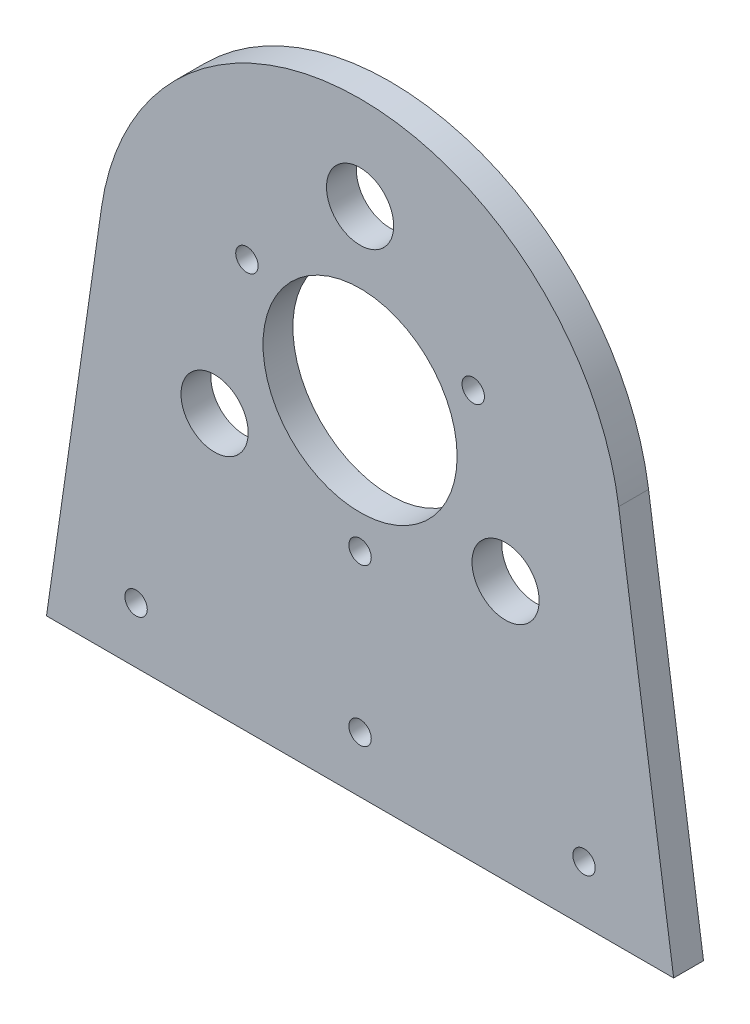
ISO-10303-21;
HEADER;
FILE_DESCRIPTION(('STEP AP214'),'2;1');
FILE_NAME('part.step','',(''),(''),'','','');
FILE_SCHEMA(('AUTOMOTIVE_DESIGN { 1 0 10303 214 1 1 1 1 }'));
ENDSEC;
DATA;
#1=APPLICATION_CONTEXT('core data for automotive mechanical design processes');
#2=APPLICATION_PROTOCOL_DEFINITION('international standard','automotive_design',2000,#1);
#3=PRODUCT_CONTEXT('',#1,'mechanical');
#4=PRODUCT('Part','Part','',(#3));
#5=PRODUCT_RELATED_PRODUCT_CATEGORY('part','',(#4));
#6=PRODUCT_DEFINITION_FORMATION('','',#4);
#7=PRODUCT_DEFINITION_CONTEXT('part definition',#1,'design');
#8=PRODUCT_DEFINITION('design','',#6,#7);
#9=PRODUCT_DEFINITION_SHAPE('','',#8);
#10=(LENGTH_UNIT() NAMED_UNIT(*) SI_UNIT(.MILLI.,.METRE.));
#11=(NAMED_UNIT(*) PLANE_ANGLE_UNIT() SI_UNIT($,.RADIAN.));
#12=(NAMED_UNIT(*) SI_UNIT($,.STERADIAN.) SOLID_ANGLE_UNIT());
#13=UNCERTAINTY_MEASURE_WITH_UNIT(LENGTH_MEASURE(1.E-05),#10,'distance_accuracy_value','');
#14=(GEOMETRIC_REPRESENTATION_CONTEXT(3) GLOBAL_UNCERTAINTY_ASSIGNED_CONTEXT((#13)) GLOBAL_UNIT_ASSIGNED_CONTEXT((#10,
#11,#12)) REPRESENTATION_CONTEXT('',''));
#15=CARTESIAN_POINT('',(0.,0.,0.));
#16=DIRECTION('',(0.,0.,1.));
#17=DIRECTION('',(1.,0.,0.));
#18=AXIS2_PLACEMENT_3D('',#15,#16,#17);
#19=CARTESIAN_POINT('',(34.6412304897537,4.99851479499249,4.));
#20=DIRECTION('',(0.989749442564391,0.142814708428357,0.));
#21=DIRECTION('',(-0.142814708428357,0.989749442564391,0.));
#22=AXIS2_PLACEMENT_3D('',#19,#20,#21);
#23=PLANE('',#22);
#24=DIRECTION('',(0.142814708428357,-0.989749442564391,0.));
#25=VECTOR('',#24,1.);
#26=CARTESIAN_POINT('',(34.6412304897537,4.99851479499249,0.));
#27=LINE('',#26,#25);
#28=CARTESIAN_POINT('',(34.6412304897537,4.9985147949925,0.));
#29=VERTEX_POINT('',#28);
#30=CARTESIAN_POINT('',(42.,-46.,0.));
#31=VERTEX_POINT('',#30);
#32=EDGE_CURVE('E114',#29,#31,#27,.T.);
#33=ORIENTED_EDGE('',*,*,#32,.F.);
#34=DIRECTION('',(0.,0.,-1.));
#35=VECTOR('',#34,1.);
#36=CARTESIAN_POINT('',(34.6412304897537,4.9985147949925,4.));
#37=LINE('',#36,#35);
#38=CARTESIAN_POINT('',(34.6412304897537,4.9985147949925,4.));
#39=VERTEX_POINT('',#38);
#40=EDGE_CURVE('E11',#39,#29,#37,.T.);
#41=ORIENTED_EDGE('',*,*,#40,.F.);
#42=DIRECTION('',(0.142814708428357,-0.989749442564391,0.));
#43=VECTOR('',#42,1.);
#44=CARTESIAN_POINT('',(34.6412304897537,4.99851479499249,4.));
#45=LINE('',#44,#43);
#46=CARTESIAN_POINT('',(42.,-46.,4.));
#47=VERTEX_POINT('',#46);
#48=EDGE_CURVE('E91',#39,#47,#45,.T.);
#49=ORIENTED_EDGE('',*,*,#48,.T.);
#50=DIRECTION('',(0.,0.,-1.));
#51=VECTOR('',#50,1.);
#52=CARTESIAN_POINT('',(42.,-46.,4.));
#53=LINE('',#52,#51);
#54=EDGE_CURVE('E58',#47,#31,#53,.T.);
#55=ORIENTED_EDGE('',*,*,#54,.T.);
#56=EDGE_LOOP('',(#33,#41,#49,#55));
#57=FACE_BOUND('',#56,.T.);
#58=ADVANCED_FACE('F41',(#57),#23,.T.);
#59=CARTESIAN_POINT('',(0.,0.,4.));
#60=DIRECTION('',(0.,0.,-1.));
#61=DIRECTION('',(-1.,0.,0.));
#62=AXIS2_PLACEMENT_3D('',#59,#60,#61);
#63=CYLINDRICAL_SURFACE('',#62,35.);
#64=CARTESIAN_POINT('',(0.,0.,0.));
#65=DIRECTION('',(0.,0.,1.));
#66=DIRECTION('',(1.,0.,0.));
#67=AXIS2_PLACEMENT_3D('',#64,#65,#66);
#68=CIRCLE('',#67,35.);
#69=CARTESIAN_POINT('',(-34.6412304897537,4.9985147949925,0.));
#70=VERTEX_POINT('',#69);
#71=EDGE_CURVE('E98',#29,#70,#68,.T.);
#72=ORIENTED_EDGE('',*,*,#71,.T.);
#73=DIRECTION('',(0.,0.,-1.));
#74=VECTOR('',#73,1.);
#75=CARTESIAN_POINT('',(-34.6412304897537,4.9985147949925,4.));
#76=LINE('',#75,#74);
#77=CARTESIAN_POINT('',(-34.6412304897537,4.9985147949925,4.));
#78=VERTEX_POINT('',#77);
#79=EDGE_CURVE('E50',#78,#70,#76,.T.);
#80=ORIENTED_EDGE('',*,*,#79,.F.);
#81=CARTESIAN_POINT('',(0.,0.,4.));
#82=DIRECTION('',(0.,0.,1.));
#83=DIRECTION('',(1.,0.,0.));
#84=AXIS2_PLACEMENT_3D('',#81,#82,#83);
#85=CIRCLE('',#84,35.);
#86=EDGE_CURVE('E84',#39,#78,#85,.T.);
#87=ORIENTED_EDGE('',*,*,#86,.F.);
#88=ORIENTED_EDGE('',*,*,#40,.T.);
#89=EDGE_LOOP('',(#72,#80,#87,#88));
#90=FACE_BOUND('',#89,.T.);
#91=ADVANCED_FACE('F96',(#90),#63,.T.);
#92=CARTESIAN_POINT('',(-34.6412304897537,4.9985147949925,4.));
#93=DIRECTION('',(-0.989749442564391,0.142814708428357,0.));
#94=DIRECTION('',(-0.142814708428357,-0.989749442564391,0.));
#95=AXIS2_PLACEMENT_3D('',#92,#93,#94);
#96=PLANE('',#95);
#97=DIRECTION('',(0.142814708428357,0.989749442564391,0.));
#98=VECTOR('',#97,1.);
#99=CARTESIAN_POINT('',(-34.6412304897537,4.9985147949925,0.));
#100=LINE('',#99,#98);
#101=CARTESIAN_POINT('',(-42.,-46.,0.));
#102=VERTEX_POINT('',#101);
#103=EDGE_CURVE('E120',#102,#70,#100,.T.);
#104=ORIENTED_EDGE('',*,*,#103,.F.);
#105=DIRECTION('',(0.,0.,-1.));
#106=VECTOR('',#105,1.);
#107=CARTESIAN_POINT('',(-42.,-46.,4.));
#108=LINE('',#107,#106);
#109=CARTESIAN_POINT('',(-42.,-46.,4.));
#110=VERTEX_POINT('',#109);
#111=EDGE_CURVE('E71',#110,#102,#108,.T.);
#112=ORIENTED_EDGE('',*,*,#111,.F.);
#113=DIRECTION('',(0.142814708428357,0.989749442564391,0.));
#114=VECTOR('',#113,1.);
#115=CARTESIAN_POINT('',(-34.6412304897537,4.9985147949925,4.));
#116=LINE('',#115,#114);
#117=EDGE_CURVE('E90',#110,#78,#116,.T.);
#118=ORIENTED_EDGE('',*,*,#117,.T.);
#119=ORIENTED_EDGE('',*,*,#79,.T.);
#120=EDGE_LOOP('',(#104,#112,#118,#119));
#121=FACE_BOUND('',#120,.T.);
#122=ADVANCED_FACE('F102',(#121),#96,.T.);
#123=CARTESIAN_POINT('',(0.,-46.,4.));
#124=DIRECTION('',(0.,-1.,0.));
#125=DIRECTION('',(1.,0.,0.));
#126=AXIS2_PLACEMENT_3D('',#123,#124,#125);
#127=PLANE('',#126);
#128=DIRECTION('',(-1.,0.,0.));
#129=VECTOR('',#128,1.);
#130=CARTESIAN_POINT('',(0.,-46.,0.));
#131=LINE('',#130,#129);
#132=EDGE_CURVE('E123',#31,#102,#131,.T.);
#133=ORIENTED_EDGE('',*,*,#132,.F.);
#134=ORIENTED_EDGE('',*,*,#54,.F.);
#135=DIRECTION('',(-1.,0.,0.));
#136=VECTOR('',#135,1.);
#137=CARTESIAN_POINT('',(0.,-46.,4.));
#138=LINE('',#137,#136);
#139=EDGE_CURVE('E104',#47,#110,#138,.T.);
#140=ORIENTED_EDGE('',*,*,#139,.T.);
#141=ORIENTED_EDGE('',*,*,#111,.T.);
#142=EDGE_LOOP('',(#133,#134,#140,#141));
#143=FACE_BOUND('',#142,.T.);
#144=ADVANCED_FACE('F260',(#143),#127,.T.);
#145=CARTESIAN_POINT('',(0.,0.,4.));
#146=DIRECTION('',(0.,0.,-1.));
#147=DIRECTION('',(-1.,0.,0.));
#148=AXIS2_PLACEMENT_3D('',#145,#146,#147);
#149=CYLINDRICAL_SURFACE('',#148,13.);
#150=CARTESIAN_POINT('',(0.,0.,4.));
#151=DIRECTION('',(0.,0.,1.));
#152=DIRECTION('',(1.,0.,0.));
#153=AXIS2_PLACEMENT_3D('',#150,#151,#152);
#154=CIRCLE('',#153,13.);
#155=CARTESIAN_POINT('',(13.,0.,4.));
#156=VERTEX_POINT('',#155);
#157=EDGE_CURVE('E107',#156,#156,#154,.T.);
#158=ORIENTED_EDGE('',*,*,#157,.T.);
#159=EDGE_LOOP('',(#158));
#160=FACE_BOUND('',#159,.T.);
#161=CARTESIAN_POINT('',(0.,0.,0.));
#162=DIRECTION('',(0.,0.,1.));
#163=DIRECTION('',(1.,0.,0.));
#164=AXIS2_PLACEMENT_3D('',#161,#162,#163);
#165=CIRCLE('',#164,13.);
#166=CARTESIAN_POINT('',(13.,0.,0.));
#167=VERTEX_POINT('',#166);
#168=EDGE_CURVE('E127',#167,#167,#165,.T.);
#169=ORIENTED_EDGE('',*,*,#168,.F.);
#170=EDGE_LOOP('',(#169));
#171=FACE_BOUND('',#170,.T.);
#172=ADVANCED_FACE('F223',(#160,#171),#149,.F.);
#173=CARTESIAN_POINT('',(0.,0.,4.));
#174=DIRECTION('',(0.,0.,1.));
#175=DIRECTION('',(1.,0.,0.));
#176=AXIS2_PLACEMENT_3D('',#173,#174,#175);
#177=PLANE('',#176);
#178=CARTESIAN_POINT('',(30.,-38.5,4.));
#179=DIRECTION('',(0.,0.,1.));
#180=DIRECTION('',(-1.,0.,0.));
#181=AXIS2_PLACEMENT_3D('',#178,#179,#180);
#182=CIRCLE('',#181,1.5);
#183=CARTESIAN_POINT('',(28.5,-38.5,4.));
#184=VERTEX_POINT('',#183);
#185=EDGE_CURVE('E194',#184,#184,#182,.T.);
#186=ORIENTED_EDGE('',*,*,#185,.F.);
#187=EDGE_LOOP('',(#186));
#188=FACE_BOUND('',#187,.T.);
#189=CARTESIAN_POINT('',(-30.,-38.5,4.));
#190=DIRECTION('',(0.,0.,1.));
#191=DIRECTION('',(1.,0.,0.));
#192=AXIS2_PLACEMENT_3D('',#189,#190,#191);
#193=CIRCLE('',#192,1.5);
#194=CARTESIAN_POINT('',(-28.5,-38.5,4.));
#195=VERTEX_POINT('',#194);
#196=EDGE_CURVE('E202',#195,#195,#193,.T.);
#197=ORIENTED_EDGE('',*,*,#196,.F.);
#198=EDGE_LOOP('',(#197));
#199=FACE_BOUND('',#198,.T.);
#200=CARTESIAN_POINT('',(0.,-38.5,4.));
#201=DIRECTION('',(0.,0.,1.));
#202=DIRECTION('',(1.,0.,0.));
#203=AXIS2_PLACEMENT_3D('',#200,#201,#202);
#204=CIRCLE('',#203,1.5);
#205=CARTESIAN_POINT('',(1.5,-38.5,4.));
#206=VERTEX_POINT('',#205);
#207=EDGE_CURVE('E186',#206,#206,#204,.T.);
#208=ORIENTED_EDGE('',*,*,#207,.F.);
#209=EDGE_LOOP('',(#208));
#210=FACE_BOUND('',#209,.T.);
#211=CARTESIAN_POINT('',(15.1554445662276,8.75000000000008,4.));
#212=DIRECTION('',(0.,0.,1.));
#213=DIRECTION('',(1.,0.,0.));
#214=AXIS2_PLACEMENT_3D('',#211,#212,#213);
#215=CIRCLE('',#214,1.5);
#216=CARTESIAN_POINT('',(16.6554445662276,8.75000000000008,4.));
#217=VERTEX_POINT('',#216);
#218=EDGE_CURVE('E143',#217,#217,#215,.T.);
#219=ORIENTED_EDGE('',*,*,#218,.F.);
#220=EDGE_LOOP('',(#219));
#221=FACE_BOUND('',#220,.T.);
#222=CARTESIAN_POINT('',(0.,-17.5,4.));
#223=DIRECTION('',(0.,0.,1.));
#224=DIRECTION('',(1.,0.,0.));
#225=AXIS2_PLACEMENT_3D('',#222,#223,#224);
#226=CIRCLE('',#225,1.5);
#227=CARTESIAN_POINT('',(1.5,-17.5,4.));
#228=VERTEX_POINT('',#227);
#229=EDGE_CURVE('E172',#228,#228,#226,.T.);
#230=ORIENTED_EDGE('',*,*,#229,.F.);
#231=EDGE_LOOP('',(#230));
#232=FACE_BOUND('',#231,.T.);
#233=CARTESIAN_POINT('',(-15.1554445662276,8.75000000000007,4.));
#234=DIRECTION('',(0.,0.,1.));
#235=DIRECTION('',(1.,0.,0.));
#236=AXIS2_PLACEMENT_3D('',#233,#234,#235);
#237=CIRCLE('',#236,1.5);
#238=CARTESIAN_POINT('',(-13.6554445662276,8.75000000000007,4.));
#239=VERTEX_POINT('',#238);
#240=EDGE_CURVE('E162',#239,#239,#237,.T.);
#241=ORIENTED_EDGE('',*,*,#240,.F.);
#242=EDGE_LOOP('',(#241));
#243=FACE_BOUND('',#242,.T.);
#244=CARTESIAN_POINT('',(0.,22.5,4.));
#245=DIRECTION('',(0.,0.,1.));
#246=DIRECTION('',(1.,0.,0.));
#247=AXIS2_PLACEMENT_3D('',#244,#245,#246);
#248=CIRCLE('',#247,4.5);
#249=CARTESIAN_POINT('',(4.5,22.5,4.));
#250=VERTEX_POINT('',#249);
#251=EDGE_CURVE('E155',#250,#250,#248,.T.);
#252=ORIENTED_EDGE('',*,*,#251,.F.);
#253=EDGE_LOOP('',(#252));
#254=FACE_BOUND('',#253,.T.);
#255=CARTESIAN_POINT('',(19.4855715851513,-11.2499999999992,4.));
#256=DIRECTION('',(0.,0.,1.));
#257=DIRECTION('',(1.,0.,0.));
#258=AXIS2_PLACEMENT_3D('',#255,#256,#257);
#259=CIRCLE('',#258,4.50000000000123);
#260=CARTESIAN_POINT('',(23.9855715851525,-11.2499999999992,4.));
#261=VERTEX_POINT('',#260);
#262=EDGE_CURVE('E147',#261,#261,#259,.T.);
#263=ORIENTED_EDGE('',*,*,#262,.F.);
#264=EDGE_LOOP('',(#263));
#265=FACE_BOUND('',#264,.T.);
#266=CARTESIAN_POINT('',(-19.4855715851484,-11.2500000000008,4.));
#267=DIRECTION('',(0.,0.,1.));
#268=DIRECTION('',(1.,0.,0.));
#269=AXIS2_PLACEMENT_3D('',#266,#267,#268);
#270=CIRCLE('',#269,4.50000000000182);
#271=CARTESIAN_POINT('',(-14.9855715851466,-11.2500000000008,4.));
#272=VERTEX_POINT('',#271);
#273=EDGE_CURVE('E138',#272,#272,#270,.T.);
#274=ORIENTED_EDGE('',*,*,#273,.F.);
#275=EDGE_LOOP('',(#274));
#276=FACE_BOUND('',#275,.T.);
#277=ORIENTED_EDGE('',*,*,#48,.F.);
#278=ORIENTED_EDGE('',*,*,#86,.T.);
#279=ORIENTED_EDGE('',*,*,#117,.F.);
#280=ORIENTED_EDGE('',*,*,#139,.F.);
#281=EDGE_LOOP('',(#277,#278,#279,#280));
#282=FACE_BOUND('',#281,.T.);
#283=ORIENTED_EDGE('',*,*,#157,.F.);
#284=EDGE_LOOP('',(#283));
#285=FACE_BOUND('',#284,.T.);
#286=ADVANCED_FACE('F86',(#188,#199,#210,#221,#232,#243,#254,#265,#276,#282,#285),#177,.T.);
#287=CARTESIAN_POINT('',(0.,0.,0.));
#288=DIRECTION('',(0.,0.,1.));
#289=DIRECTION('',(1.,0.,0.));
#290=AXIS2_PLACEMENT_3D('',#287,#288,#289);
#291=PLANE('',#290);
#292=CARTESIAN_POINT('',(30.,-38.5,0.));
#293=DIRECTION('',(0.,0.,1.));
#294=DIRECTION('',(-1.,0.,0.));
#295=AXIS2_PLACEMENT_3D('',#292,#293,#294);
#296=CIRCLE('',#295,1.5);
#297=CARTESIAN_POINT('',(28.5,-38.5,0.));
#298=VERTEX_POINT('',#297);
#299=EDGE_CURVE('E198',#298,#298,#296,.T.);
#300=ORIENTED_EDGE('',*,*,#299,.T.);
#301=EDGE_LOOP('',(#300));
#302=FACE_BOUND('',#301,.T.);
#303=CARTESIAN_POINT('',(-30.,-38.5,0.));
#304=DIRECTION('',(0.,0.,1.));
#305=DIRECTION('',(1.,0.,0.));
#306=AXIS2_PLACEMENT_3D('',#303,#304,#305);
#307=CIRCLE('',#306,1.5);
#308=CARTESIAN_POINT('',(-28.5,-38.5,0.));
#309=VERTEX_POINT('',#308);
#310=EDGE_CURVE('E190',#309,#309,#307,.T.);
#311=ORIENTED_EDGE('',*,*,#310,.T.);
#312=EDGE_LOOP('',(#311));
#313=FACE_BOUND('',#312,.T.);
#314=CARTESIAN_POINT('',(0.,-38.5,0.));
#315=DIRECTION('',(0.,0.,1.));
#316=DIRECTION('',(1.,0.,0.));
#317=AXIS2_PLACEMENT_3D('',#314,#315,#316);
#318=CIRCLE('',#317,1.5);
#319=CARTESIAN_POINT('',(1.5,-38.5,0.));
#320=VERTEX_POINT('',#319);
#321=EDGE_CURVE('E171',#320,#320,#318,.T.);
#322=ORIENTED_EDGE('',*,*,#321,.T.);
#323=EDGE_LOOP('',(#322));
#324=FACE_BOUND('',#323,.T.);
#325=CARTESIAN_POINT('',(15.1554445662276,8.75000000000008,0.));
#326=DIRECTION('',(0.,0.,1.));
#327=DIRECTION('',(1.,0.,0.));
#328=AXIS2_PLACEMENT_3D('',#325,#326,#327);
#329=CIRCLE('',#328,1.5);
#330=CARTESIAN_POINT('',(16.6554445662276,8.75000000000008,0.));
#331=VERTEX_POINT('',#330);
#332=EDGE_CURVE('E176',#331,#331,#329,.T.);
#333=ORIENTED_EDGE('',*,*,#332,.T.);
#334=EDGE_LOOP('',(#333));
#335=FACE_BOUND('',#334,.T.);
#336=CARTESIAN_POINT('',(0.,-17.5,0.));
#337=DIRECTION('',(0.,0.,1.));
#338=DIRECTION('',(1.,0.,0.));
#339=AXIS2_PLACEMENT_3D('',#336,#337,#338);
#340=CIRCLE('',#339,1.5);
#341=CARTESIAN_POINT('',(1.5,-17.5,0.));
#342=VERTEX_POINT('',#341);
#343=EDGE_CURVE('E166',#342,#342,#340,.T.);
#344=ORIENTED_EDGE('',*,*,#343,.T.);
#345=EDGE_LOOP('',(#344));
#346=FACE_BOUND('',#345,.T.);
#347=CARTESIAN_POINT('',(-15.1554445662276,8.75000000000007,0.));
#348=DIRECTION('',(0.,0.,1.));
#349=DIRECTION('',(1.,0.,0.));
#350=AXIS2_PLACEMENT_3D('',#347,#348,#349);
#351=CIRCLE('',#350,1.5);
#352=CARTESIAN_POINT('',(-13.6554445662276,8.75000000000007,0.));
#353=VERTEX_POINT('',#352);
#354=EDGE_CURVE('E167',#353,#353,#351,.T.);
#355=ORIENTED_EDGE('',*,*,#354,.T.);
#356=EDGE_LOOP('',(#355));
#357=FACE_BOUND('',#356,.T.);
#358=CARTESIAN_POINT('',(0.,22.5,0.));
#359=DIRECTION('',(0.,0.,1.));
#360=DIRECTION('',(1.,0.,0.));
#361=AXIS2_PLACEMENT_3D('',#358,#359,#360);
#362=CIRCLE('',#361,4.5);
#363=CARTESIAN_POINT('',(4.5,22.5,0.));
#364=VERTEX_POINT('',#363);
#365=EDGE_CURVE('E117',#364,#364,#362,.T.);
#366=ORIENTED_EDGE('',*,*,#365,.T.);
#367=EDGE_LOOP('',(#366));
#368=FACE_BOUND('',#367,.T.);
#369=CARTESIAN_POINT('',(19.4855715851513,-11.2499999999992,0.));
#370=DIRECTION('',(0.,0.,1.));
#371=DIRECTION('',(1.,0.,0.));
#372=AXIS2_PLACEMENT_3D('',#369,#370,#371);
#373=CIRCLE('',#372,4.50000000000123);
#374=CARTESIAN_POINT('',(23.9855715851525,-11.2499999999992,0.));
#375=VERTEX_POINT('',#374);
#376=EDGE_CURVE('E151',#375,#375,#373,.T.);
#377=ORIENTED_EDGE('',*,*,#376,.T.);
#378=EDGE_LOOP('',(#377));
#379=FACE_BOUND('',#378,.T.);
#380=CARTESIAN_POINT('',(-19.4855715851484,-11.2500000000008,0.));
#381=DIRECTION('',(0.,0.,1.));
#382=DIRECTION('',(1.,0.,0.));
#383=AXIS2_PLACEMENT_3D('',#380,#381,#382);
#384=CIRCLE('',#383,4.50000000000182);
#385=CARTESIAN_POINT('',(-14.9855715851466,-11.2500000000008,0.));
#386=VERTEX_POINT('',#385);
#387=EDGE_CURVE('E142',#386,#386,#384,.T.);
#388=ORIENTED_EDGE('',*,*,#387,.T.);
#389=EDGE_LOOP('',(#388));
#390=FACE_BOUND('',#389,.T.);
#391=ORIENTED_EDGE('',*,*,#32,.T.);
#392=ORIENTED_EDGE('',*,*,#132,.T.);
#393=ORIENTED_EDGE('',*,*,#103,.T.);
#394=ORIENTED_EDGE('',*,*,#71,.F.);
#395=EDGE_LOOP('',(#391,#392,#393,#394));
#396=FACE_BOUND('',#395,.T.);
#397=ORIENTED_EDGE('',*,*,#168,.T.);
#398=EDGE_LOOP('',(#397));
#399=FACE_BOUND('',#398,.T.);
#400=ADVANCED_FACE('F210',(#302,#313,#324,#335,#346,#357,#368,#379,#390,#396,#399),#291,.F.);
#401=CARTESIAN_POINT('',(-19.4855715851484,-11.2500000000008,0.));
#402=DIRECTION('',(0.,0.,1.));
#403=DIRECTION('',(1.,0.,0.));
#404=AXIS2_PLACEMENT_3D('',#401,#402,#403);
#405=CYLINDRICAL_SURFACE('',#404,4.50000000000182);
#406=ORIENTED_EDGE('',*,*,#387,.F.);
#407=EDGE_LOOP('',(#406));
#408=FACE_BOUND('',#407,.T.);
#409=ORIENTED_EDGE('',*,*,#273,.T.);
#410=EDGE_LOOP('',(#409));
#411=FACE_BOUND('',#410,.T.);
#412=ADVANCED_FACE('F240',(#408,#411),#405,.F.);
#413=CARTESIAN_POINT('',(19.4855715851513,-11.2499999999992,0.));
#414=DIRECTION('',(0.,0.,1.));
#415=DIRECTION('',(1.,0.,0.));
#416=AXIS2_PLACEMENT_3D('',#413,#414,#415);
#417=CYLINDRICAL_SURFACE('',#416,4.50000000000123);
#418=ORIENTED_EDGE('',*,*,#376,.F.);
#419=EDGE_LOOP('',(#418));
#420=FACE_BOUND('',#419,.T.);
#421=ORIENTED_EDGE('',*,*,#262,.T.);
#422=EDGE_LOOP('',(#421));
#423=FACE_BOUND('',#422,.T.);
#424=ADVANCED_FACE('F242',(#420,#423),#417,.F.);
#425=CARTESIAN_POINT('',(0.,22.5,0.));
#426=DIRECTION('',(0.,0.,1.));
#427=DIRECTION('',(1.,0.,0.));
#428=AXIS2_PLACEMENT_3D('',#425,#426,#427);
#429=CYLINDRICAL_SURFACE('',#428,4.5);
#430=ORIENTED_EDGE('',*,*,#365,.F.);
#431=EDGE_LOOP('',(#430));
#432=FACE_BOUND('',#431,.T.);
#433=ORIENTED_EDGE('',*,*,#251,.T.);
#434=EDGE_LOOP('',(#433));
#435=FACE_BOUND('',#434,.T.);
#436=ADVANCED_FACE('F249',(#432,#435),#429,.F.);
#437=CARTESIAN_POINT('',(-15.1554445662276,8.75000000000007,8.24264068711929));
#438=DIRECTION('',(0.,0.,-1.));
#439=DIRECTION('',(-1.,0.,0.));
#440=AXIS2_PLACEMENT_3D('',#437,#438,#439);
#441=CYLINDRICAL_SURFACE('',#440,1.5);
#442=ORIENTED_EDGE('',*,*,#354,.F.);
#443=EDGE_LOOP('',(#442));
#444=FACE_BOUND('',#443,.T.);
#445=ORIENTED_EDGE('',*,*,#240,.T.);
#446=EDGE_LOOP('',(#445));
#447=FACE_BOUND('',#446,.T.);
#448=ADVANCED_FACE('F337',(#444,#447),#441,.F.);
#449=CARTESIAN_POINT('',(0.,-17.5,8.24264068711929));
#450=DIRECTION('',(0.,0.,-1.));
#451=DIRECTION('',(-1.,0.,0.));
#452=AXIS2_PLACEMENT_3D('',#449,#450,#451);
#453=CYLINDRICAL_SURFACE('',#452,1.5);
#454=ORIENTED_EDGE('',*,*,#343,.F.);
#455=EDGE_LOOP('',(#454));
#456=FACE_BOUND('',#455,.T.);
#457=ORIENTED_EDGE('',*,*,#229,.T.);
#458=EDGE_LOOP('',(#457));
#459=FACE_BOUND('',#458,.T.);
#460=ADVANCED_FACE('F346',(#456,#459),#453,.F.);
#461=CARTESIAN_POINT('',(15.1554445662276,8.75000000000008,8.24264068711929));
#462=DIRECTION('',(0.,0.,-1.));
#463=DIRECTION('',(-1.,0.,0.));
#464=AXIS2_PLACEMENT_3D('',#461,#462,#463);
#465=CYLINDRICAL_SURFACE('',#464,1.5);
#466=ORIENTED_EDGE('',*,*,#332,.F.);
#467=EDGE_LOOP('',(#466));
#468=FACE_BOUND('',#467,.T.);
#469=ORIENTED_EDGE('',*,*,#218,.T.);
#470=EDGE_LOOP('',(#469));
#471=FACE_BOUND('',#470,.T.);
#472=ADVANCED_FACE('F355',(#468,#471),#465,.F.);
#473=CARTESIAN_POINT('',(0.,-38.5,0.));
#474=DIRECTION('',(0.,0.,1.));
#475=DIRECTION('',(1.,0.,0.));
#476=AXIS2_PLACEMENT_3D('',#473,#474,#475);
#477=CYLINDRICAL_SURFACE('',#476,1.5);
#478=ORIENTED_EDGE('',*,*,#321,.F.);
#479=EDGE_LOOP('',(#478));
#480=FACE_BOUND('',#479,.T.);
#481=ORIENTED_EDGE('',*,*,#207,.T.);
#482=EDGE_LOOP('',(#481));
#483=FACE_BOUND('',#482,.T.);
#484=ADVANCED_FACE('F217',(#480,#483),#477,.F.);
#485=CARTESIAN_POINT('',(-30.,-38.5,0.));
#486=DIRECTION('',(0.,0.,1.));
#487=DIRECTION('',(1.,0.,0.));
#488=AXIS2_PLACEMENT_3D('',#485,#486,#487);
#489=CYLINDRICAL_SURFACE('',#488,1.5);
#490=ORIENTED_EDGE('',*,*,#310,.F.);
#491=EDGE_LOOP('',(#490));
#492=FACE_BOUND('',#491,.T.);
#493=ORIENTED_EDGE('',*,*,#196,.T.);
#494=EDGE_LOOP('',(#493));
#495=FACE_BOUND('',#494,.T.);
#496=ADVANCED_FACE('F213',(#492,#495),#489,.F.);
#497=CARTESIAN_POINT('',(30.,-38.5,0.));
#498=DIRECTION('',(0.,0.,1.));
#499=DIRECTION('',(1.,0.,0.));
#500=AXIS2_PLACEMENT_3D('',#497,#498,#499);
#501=CYLINDRICAL_SURFACE('',#500,1.5);
#502=ORIENTED_EDGE('',*,*,#299,.F.);
#503=EDGE_LOOP('',(#502));
#504=FACE_BOUND('',#503,.T.);
#505=ORIENTED_EDGE('',*,*,#185,.T.);
#506=EDGE_LOOP('',(#505));
#507=FACE_BOUND('',#506,.T.);
#508=ADVANCED_FACE('F216',(#504,#507),#501,.F.);
#509=CLOSED_SHELL('',(#58,#91,#122,#144,#172,#286,#400,#412,#424,#436,#448,#460,#472,#484,#496,#508));
#510=MANIFOLD_SOLID_BREP('B2',#509);
#511=ADVANCED_BREP_SHAPE_REPRESENTATION('',(#18,#510),#14);
#512=SHAPE_DEFINITION_REPRESENTATION(#9,#511);
ENDSEC;
END-ISO-10303-21;
